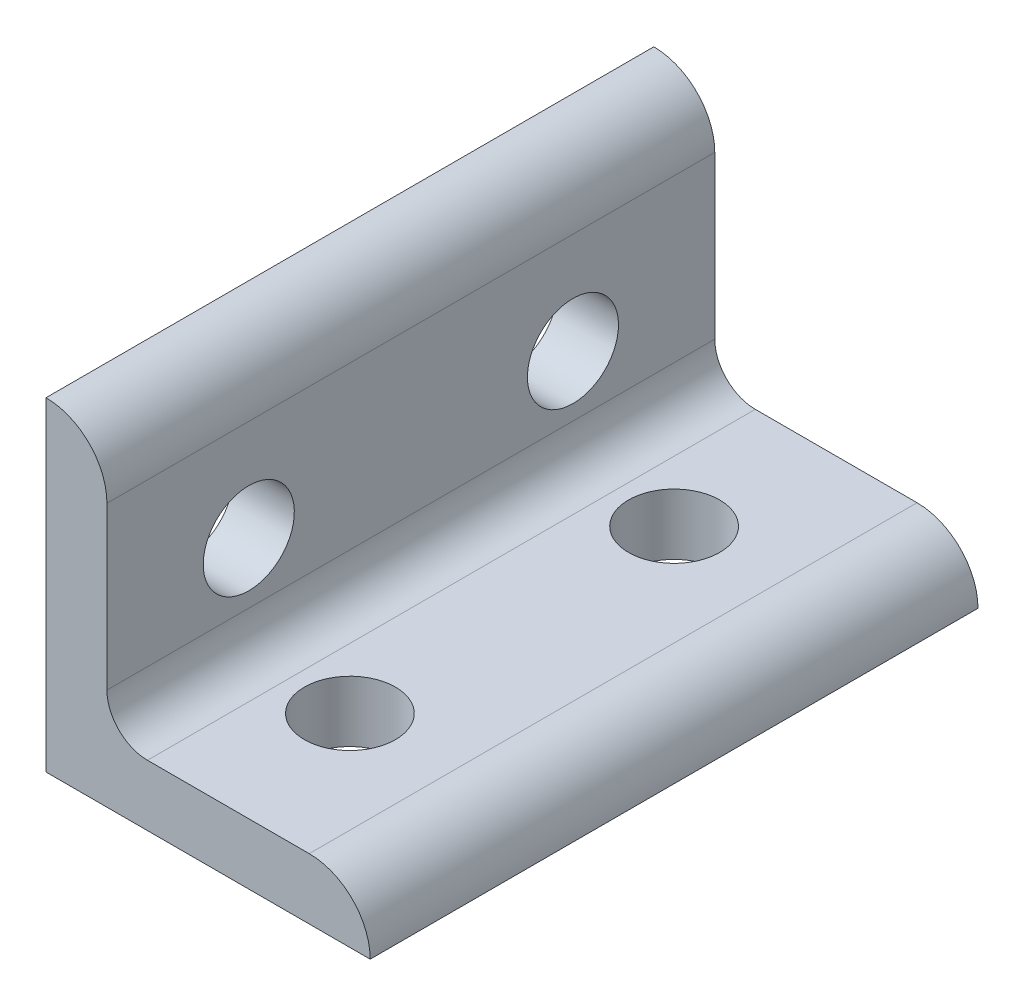
ISO-10303-21;
HEADER;
FILE_DESCRIPTION(('STEP AP214'),'2;1');
FILE_NAME('part.step','',(''),(''),'','','');
FILE_SCHEMA(('AUTOMOTIVE_DESIGN { 1 0 10303 214 1 1 1 1 }'));
ENDSEC;
DATA;
#1=APPLICATION_CONTEXT('core data for automotive mechanical design processes');
#2=APPLICATION_PROTOCOL_DEFINITION('international standard','automotive_design',2000,#1);
#3=PRODUCT_CONTEXT('',#1,'mechanical');
#4=PRODUCT('Part','Part','',(#3));
#5=PRODUCT_RELATED_PRODUCT_CATEGORY('part','',(#4));
#6=PRODUCT_DEFINITION_FORMATION('','',#4);
#7=PRODUCT_DEFINITION_CONTEXT('part definition',#1,'design');
#8=PRODUCT_DEFINITION('design','',#6,#7);
#9=PRODUCT_DEFINITION_SHAPE('','',#8);
#10=(LENGTH_UNIT() NAMED_UNIT(*) SI_UNIT(.MILLI.,.METRE.));
#11=(NAMED_UNIT(*) PLANE_ANGLE_UNIT() SI_UNIT($,.RADIAN.));
#12=(NAMED_UNIT(*) SI_UNIT($,.STERADIAN.) SOLID_ANGLE_UNIT());
#13=UNCERTAINTY_MEASURE_WITH_UNIT(LENGTH_MEASURE(1.E-05),#10,'distance_accuracy_value','');
#14=(GEOMETRIC_REPRESENTATION_CONTEXT(3) GLOBAL_UNCERTAINTY_ASSIGNED_CONTEXT((#13)) GLOBAL_UNIT_ASSIGNED_CONTEXT((#10,
#11,#12)) REPRESENTATION_CONTEXT('',''));
#15=CARTESIAN_POINT('',(0.,0.,0.));
#16=DIRECTION('',(0.,0.,1.));
#17=DIRECTION('',(1.,0.,0.));
#18=AXIS2_PLACEMENT_3D('',#15,#16,#17);
#19=CARTESIAN_POINT('',(4.7752,20.6248,23.8125));
#20=DIRECTION('',(-1.,0.,0.));
#21=DIRECTION('',(0.,-1.,0.));
#22=AXIS2_PLACEMENT_3D('',#19,#20,#21);
#23=PLANE('',#22);
#24=CARTESIAN_POINT('',(4.7752,12.7,12.7));
#25=DIRECTION('',(-1.,0.,0.));
#26=DIRECTION('',(0.,-1.,0.));
#27=AXIS2_PLACEMENT_3D('',#24,#25,#26);
#28=CIRCLE('',#27,3.5687);
#29=CARTESIAN_POINT('',(4.7752,9.1313,12.7));
#30=VERTEX_POINT('',#29);
#31=EDGE_CURVE('E199',#30,#30,#28,.F.);
#32=ORIENTED_EDGE('',*,*,#31,.F.);
#33=EDGE_LOOP('',(#32));
#34=FACE_BOUND('',#33,.T.);
#35=DIRECTION('',(0.,1.,0.));
#36=VECTOR('',#35,1.);
#37=CARTESIAN_POINT('',(4.7752,20.6248,-23.8125));
#38=LINE('',#37,#36);
#39=CARTESIAN_POINT('',(4.7752,7.9502,-23.8125));
#40=VERTEX_POINT('',#39);
#41=CARTESIAN_POINT('',(4.7752,20.6248,-23.8125));
#42=VERTEX_POINT('',#41);
#43=EDGE_CURVE('E120',#40,#42,#38,.T.);
#44=ORIENTED_EDGE('',*,*,#43,.T.);
#45=DIRECTION('',(0.,0.,-1.));
#46=VECTOR('',#45,1.);
#47=CARTESIAN_POINT('',(4.7752,20.6248,23.8125));
#48=LINE('',#47,#46);
#49=CARTESIAN_POINT('',(4.7752,20.6248,23.8125));
#50=VERTEX_POINT('',#49);
#51=EDGE_CURVE('E117',#50,#42,#48,.T.);
#52=ORIENTED_EDGE('',*,*,#51,.F.);
#53=DIRECTION('',(0.,1.,0.));
#54=VECTOR('',#53,1.);
#55=CARTESIAN_POINT('',(4.7752,20.6248,23.8125));
#56=LINE('',#55,#54);
#57=CARTESIAN_POINT('',(4.7752,7.9502,23.8125));
#58=VERTEX_POINT('',#57);
#59=EDGE_CURVE('E106',#58,#50,#56,.T.);
#60=ORIENTED_EDGE('',*,*,#59,.F.);
#61=DIRECTION('',(0.,0.,-1.));
#62=VECTOR('',#61,1.);
#63=CARTESIAN_POINT('',(4.7752,7.9502,23.8125));
#64=LINE('',#63,#62);
#65=EDGE_CURVE('E121',#58,#40,#64,.T.);
#66=ORIENTED_EDGE('',*,*,#65,.T.);
#67=EDGE_LOOP('',(#44,#52,#60,#66));
#68=FACE_BOUND('',#67,.T.);
#69=CARTESIAN_POINT('',(4.7752,12.7,-12.7));
#70=DIRECTION('',(-1.,0.,0.));
#71=DIRECTION('',(0.,-1.,0.));
#72=AXIS2_PLACEMENT_3D('',#69,#70,#71);
#73=CIRCLE('',#72,3.5687);
#74=CARTESIAN_POINT('',(4.7752,9.1313,-12.7));
#75=VERTEX_POINT('',#74);
#76=EDGE_CURVE('E192',#75,#75,#73,.F.);
#77=ORIENTED_EDGE('',*,*,#76,.F.);
#78=EDGE_LOOP('',(#77));
#79=FACE_BOUND('',#78,.T.);
#80=ADVANCED_FACE('F37',(#34,#68,#79),#23,.F.);
#81=CARTESIAN_POINT('',(0.,0.,23.8125));
#82=DIRECTION('',(1.,0.,0.));
#83=DIRECTION('',(0.,0.,-1.));
#84=AXIS2_PLACEMENT_3D('',#81,#82,#83);
#85=PLANE('',#84);
#86=CARTESIAN_POINT('',(0.,12.7,12.7));
#87=DIRECTION('',(1.,0.,0.));
#88=DIRECTION('',(0.,0.,-1.));
#89=AXIS2_PLACEMENT_3D('',#86,#87,#88);
#90=CIRCLE('',#89,3.5687);
#91=CARTESIAN_POINT('',(0.,12.7,9.1313));
#92=VERTEX_POINT('',#91);
#93=EDGE_CURVE('E195',#92,#92,#90,.T.);
#94=ORIENTED_EDGE('',*,*,#93,.T.);
#95=EDGE_LOOP('',(#94));
#96=FACE_BOUND('',#95,.T.);
#97=DIRECTION('',(0.,-1.,0.));
#98=VECTOR('',#97,1.);
#99=CARTESIAN_POINT('',(0.,0.,-23.8125));
#100=LINE('',#99,#98);
#101=CARTESIAN_POINT('',(0.,25.4,-23.8125));
#102=VERTEX_POINT('',#101);
#103=CARTESIAN_POINT('',(0.,0.,-23.8125));
#104=VERTEX_POINT('',#103);
#105=EDGE_CURVE('E88',#102,#104,#100,.T.);
#106=ORIENTED_EDGE('',*,*,#105,.T.);
#107=DIRECTION('',(0.,0.,-1.));
#108=VECTOR('',#107,1.);
#109=CARTESIAN_POINT('',(0.,0.,23.8125));
#110=LINE('',#109,#108);
#111=CARTESIAN_POINT('',(0.,0.,23.8125));
#112=VERTEX_POINT('',#111);
#113=EDGE_CURVE('E126',#112,#104,#110,.T.);
#114=ORIENTED_EDGE('',*,*,#113,.F.);
#115=DIRECTION('',(0.,-1.,0.));
#116=VECTOR('',#115,1.);
#117=CARTESIAN_POINT('',(0.,0.,23.8125));
#118=LINE('',#117,#116);
#119=CARTESIAN_POINT('',(0.,25.4,23.8125));
#120=VERTEX_POINT('',#119);
#121=EDGE_CURVE('E56',#120,#112,#118,.T.);
#122=ORIENTED_EDGE('',*,*,#121,.F.);
#123=DIRECTION('',(0.,0.,-1.));
#124=VECTOR('',#123,1.);
#125=CARTESIAN_POINT('',(0.,25.4,23.8125));
#126=LINE('',#125,#124);
#127=EDGE_CURVE('E122',#120,#102,#126,.T.);
#128=ORIENTED_EDGE('',*,*,#127,.T.);
#129=EDGE_LOOP('',(#106,#114,#122,#128));
#130=FACE_BOUND('',#129,.T.);
#131=CARTESIAN_POINT('',(0.,12.7,-12.7));
#132=DIRECTION('',(1.,0.,0.));
#133=DIRECTION('',(0.,0.,-1.));
#134=AXIS2_PLACEMENT_3D('',#131,#132,#133);
#135=CIRCLE('',#134,3.5687);
#136=CARTESIAN_POINT('',(0.,12.7,-16.2687));
#137=VERTEX_POINT('',#136);
#138=EDGE_CURVE('E190',#137,#137,#135,.T.);
#139=ORIENTED_EDGE('',*,*,#138,.T.);
#140=EDGE_LOOP('',(#139));
#141=FACE_BOUND('',#140,.T.);
#142=ADVANCED_FACE('F183',(#96,#130,#141),#85,.F.);
#143=CARTESIAN_POINT('',(25.4,0.,23.8125));
#144=DIRECTION('',(0.,1.,0.));
#145=DIRECTION('',(-1.,0.,0.));
#146=AXIS2_PLACEMENT_3D('',#143,#144,#145);
#147=PLANE('',#146);
#148=CARTESIAN_POINT('',(12.7,0.,12.7));
#149=DIRECTION('',(0.,1.,0.));
#150=DIRECTION('',(0.,0.,1.));
#151=AXIS2_PLACEMENT_3D('',#148,#149,#150);
#152=CIRCLE('',#151,3.56869999999999);
#153=CARTESIAN_POINT('',(12.7,0.,9.13130000000001));
#154=VERTEX_POINT('',#153);
#155=EDGE_CURVE('E152',#154,#154,#152,.T.);
#156=ORIENTED_EDGE('',*,*,#155,.T.);
#157=EDGE_LOOP('',(#156));
#158=FACE_BOUND('',#157,.T.);
#159=DIRECTION('',(1.,0.,0.));
#160=VECTOR('',#159,1.);
#161=CARTESIAN_POINT('',(25.4,0.,-23.8125));
#162=LINE('',#161,#160);
#163=CARTESIAN_POINT('',(25.4,0.,-23.8125));
#164=VERTEX_POINT('',#163);
#165=EDGE_CURVE('E130',#104,#164,#162,.T.);
#166=ORIENTED_EDGE('',*,*,#165,.T.);
#167=DIRECTION('',(0.,0.,-1.));
#168=VECTOR('',#167,1.);
#169=CARTESIAN_POINT('',(25.4,0.,23.8125));
#170=LINE('',#169,#168);
#171=CARTESIAN_POINT('',(25.4,0.,23.8125));
#172=VERTEX_POINT('',#171);
#173=EDGE_CURVE('E11',#172,#164,#170,.T.);
#174=ORIENTED_EDGE('',*,*,#173,.F.);
#175=DIRECTION('',(1.,0.,0.));
#176=VECTOR('',#175,1.);
#177=CARTESIAN_POINT('',(25.4,0.,23.8125));
#178=LINE('',#177,#176);
#179=EDGE_CURVE('E143',#112,#172,#178,.T.);
#180=ORIENTED_EDGE('',*,*,#179,.F.);
#181=ORIENTED_EDGE('',*,*,#113,.T.);
#182=EDGE_LOOP('',(#166,#174,#180,#181));
#183=FACE_BOUND('',#182,.T.);
#184=CARTESIAN_POINT('',(12.7,0.,-12.7));
#185=DIRECTION('',(0.,1.,0.));
#186=DIRECTION('',(0.,0.,1.));
#187=AXIS2_PLACEMENT_3D('',#184,#185,#186);
#188=CIRCLE('',#187,3.5687);
#189=CARTESIAN_POINT('',(12.7,0.,-16.2687));
#190=VERTEX_POINT('',#189);
#191=EDGE_CURVE('E160',#190,#190,#188,.T.);
#192=ORIENTED_EDGE('',*,*,#191,.T.);
#193=EDGE_LOOP('',(#192));
#194=FACE_BOUND('',#193,.T.);
#195=ADVANCED_FACE('F39',(#158,#183,#194),#147,.F.);
#196=CARTESIAN_POINT('',(7.9502,4.7752,23.8125));
#197=DIRECTION('',(0.,-1.,0.));
#198=DIRECTION('',(0.,0.,-1.));
#199=AXIS2_PLACEMENT_3D('',#196,#197,#198);
#200=PLANE('',#199);
#201=CARTESIAN_POINT('',(12.7,4.7752,12.7));
#202=DIRECTION('',(0.,-1.,0.));
#203=DIRECTION('',(0.,0.,-1.));
#204=AXIS2_PLACEMENT_3D('',#201,#202,#203);
#205=CIRCLE('',#204,3.56869999999999);
#206=CARTESIAN_POINT('',(12.7,4.7752,9.13130000000001));
#207=VERTEX_POINT('',#206);
#208=EDGE_CURVE('E134',#207,#207,#205,.F.);
#209=ORIENTED_EDGE('',*,*,#208,.F.);
#210=EDGE_LOOP('',(#209));
#211=FACE_BOUND('',#210,.T.);
#212=DIRECTION('',(-1.,0.,0.));
#213=VECTOR('',#212,1.);
#214=CARTESIAN_POINT('',(7.9502,4.7752,-23.8125));
#215=LINE('',#214,#213);
#216=CARTESIAN_POINT('',(20.6248,4.7752,-23.8125));
#217=VERTEX_POINT('',#216);
#218=CARTESIAN_POINT('',(7.9502,4.7752,-23.8125));
#219=VERTEX_POINT('',#218);
#220=EDGE_CURVE('E136',#217,#219,#215,.T.);
#221=ORIENTED_EDGE('',*,*,#220,.T.);
#222=DIRECTION('',(0.,0.,-1.));
#223=VECTOR('',#222,1.);
#224=CARTESIAN_POINT('',(7.9502,4.7752,23.8125));
#225=LINE('',#224,#223);
#226=CARTESIAN_POINT('',(7.9502,4.7752,23.8125));
#227=VERTEX_POINT('',#226);
#228=EDGE_CURVE('E147',#227,#219,#225,.T.);
#229=ORIENTED_EDGE('',*,*,#228,.F.);
#230=DIRECTION('',(-1.,0.,0.));
#231=VECTOR('',#230,1.);
#232=CARTESIAN_POINT('',(7.9502,4.7752,23.8125));
#233=LINE('',#232,#231);
#234=CARTESIAN_POINT('',(20.6248,4.7752,23.8125));
#235=VERTEX_POINT('',#234);
#236=EDGE_CURVE('E166',#235,#227,#233,.T.);
#237=ORIENTED_EDGE('',*,*,#236,.F.);
#238=DIRECTION('',(0.,0.,-1.));
#239=VECTOR('',#238,1.);
#240=CARTESIAN_POINT('',(20.6248,4.7752,23.8125));
#241=LINE('',#240,#239);
#242=EDGE_CURVE('E47',#235,#217,#241,.T.);
#243=ORIENTED_EDGE('',*,*,#242,.T.);
#244=EDGE_LOOP('',(#221,#229,#237,#243));
#245=FACE_BOUND('',#244,.T.);
#246=CARTESIAN_POINT('',(12.7,4.7752,-12.7));
#247=DIRECTION('',(0.,-1.,0.));
#248=DIRECTION('',(0.,0.,-1.));
#249=AXIS2_PLACEMENT_3D('',#246,#247,#248);
#250=CIRCLE('',#249,3.5687);
#251=CARTESIAN_POINT('',(12.7,4.7752,-16.2687));
#252=VERTEX_POINT('',#251);
#253=EDGE_CURVE('E41',#252,#252,#250,.F.);
#254=ORIENTED_EDGE('',*,*,#253,.F.);
#255=EDGE_LOOP('',(#254));
#256=FACE_BOUND('',#255,.T.);
#257=ADVANCED_FACE('F170',(#211,#245,#256),#200,.F.);
#258=CARTESIAN_POINT('',(20.6248,0.,23.8125));
#259=DIRECTION('',(0.,0.,-1.));
#260=DIRECTION('',(-1.,0.,0.));
#261=AXIS2_PLACEMENT_3D('',#258,#259,#260);
#262=CYLINDRICAL_SURFACE('',#261,4.7752);
#263=CARTESIAN_POINT('',(20.6248,0.,-23.8125));
#264=DIRECTION('',(0.,0.,1.));
#265=DIRECTION('',(1.,0.,0.));
#266=AXIS2_PLACEMENT_3D('',#263,#264,#265);
#267=CIRCLE('',#266,4.7752);
#268=EDGE_CURVE('E133',#164,#217,#267,.T.);
#269=ORIENTED_EDGE('',*,*,#268,.T.);
#270=ORIENTED_EDGE('',*,*,#242,.F.);
#271=CARTESIAN_POINT('',(20.6248,0.,23.8125));
#272=DIRECTION('',(0.,0.,1.));
#273=DIRECTION('',(1.,0.,0.));
#274=AXIS2_PLACEMENT_3D('',#271,#272,#273);
#275=CIRCLE('',#274,4.7752);
#276=EDGE_CURVE('E96',#172,#235,#275,.T.);
#277=ORIENTED_EDGE('',*,*,#276,.F.);
#278=ORIENTED_EDGE('',*,*,#173,.T.);
#279=EDGE_LOOP('',(#269,#270,#277,#278));
#280=FACE_BOUND('',#279,.T.);
#281=ADVANCED_FACE('F214',(#280),#262,.T.);
#282=CARTESIAN_POINT('',(7.9502,7.9502,23.8125));
#283=DIRECTION('',(0.,0.,-1.));
#284=DIRECTION('',(-1.,0.,0.));
#285=AXIS2_PLACEMENT_3D('',#282,#283,#284);
#286=CYLINDRICAL_SURFACE('',#285,3.175);
#287=CARTESIAN_POINT('',(7.9502,7.9502,-23.8125));
#288=DIRECTION('',(0.,0.,-1.));
#289=DIRECTION('',(1.,0.,0.));
#290=AXIS2_PLACEMENT_3D('',#287,#288,#289);
#291=CIRCLE('',#290,3.175);
#292=EDGE_CURVE('E138',#219,#40,#291,.T.);
#293=ORIENTED_EDGE('',*,*,#292,.T.);
#294=ORIENTED_EDGE('',*,*,#65,.F.);
#295=CARTESIAN_POINT('',(7.9502,7.9502,23.8125));
#296=DIRECTION('',(0.,0.,-1.));
#297=DIRECTION('',(1.,0.,0.));
#298=AXIS2_PLACEMENT_3D('',#295,#296,#297);
#299=CIRCLE('',#298,3.175);
#300=EDGE_CURVE('E112',#227,#58,#299,.T.);
#301=ORIENTED_EDGE('',*,*,#300,.F.);
#302=ORIENTED_EDGE('',*,*,#228,.T.);
#303=EDGE_LOOP('',(#293,#294,#301,#302));
#304=FACE_BOUND('',#303,.T.);
#305=ADVANCED_FACE('F175',(#304),#286,.F.);
#306=CARTESIAN_POINT('',(0.,20.6248,23.8125));
#307=DIRECTION('',(0.,0.,-1.));
#308=DIRECTION('',(-1.,0.,0.));
#309=AXIS2_PLACEMENT_3D('',#306,#307,#308);
#310=CYLINDRICAL_SURFACE('',#309,4.7752);
#311=CARTESIAN_POINT('',(0.,20.6248,-23.8125));
#312=DIRECTION('',(0.,0.,1.));
#313=DIRECTION('',(1.,0.,0.));
#314=AXIS2_PLACEMENT_3D('',#311,#312,#313);
#315=CIRCLE('',#314,4.7752);
#316=EDGE_CURVE('E82',#42,#102,#315,.T.);
#317=ORIENTED_EDGE('',*,*,#316,.T.);
#318=ORIENTED_EDGE('',*,*,#127,.F.);
#319=CARTESIAN_POINT('',(0.,20.6248,23.8125));
#320=DIRECTION('',(0.,0.,1.));
#321=DIRECTION('',(1.,0.,0.));
#322=AXIS2_PLACEMENT_3D('',#319,#320,#321);
#323=CIRCLE('',#322,4.7752);
#324=EDGE_CURVE('E110',#50,#120,#323,.T.);
#325=ORIENTED_EDGE('',*,*,#324,.F.);
#326=ORIENTED_EDGE('',*,*,#51,.T.);
#327=EDGE_LOOP('',(#317,#318,#325,#326));
#328=FACE_BOUND('',#327,.T.);
#329=ADVANCED_FACE('F124',(#328),#310,.T.);
#330=CARTESIAN_POINT('',(0.,20.6248,23.8125));
#331=DIRECTION('',(0.,0.,1.));
#332=DIRECTION('',(1.,0.,0.));
#333=AXIS2_PLACEMENT_3D('',#330,#331,#332);
#334=PLANE('',#333);
#335=ORIENTED_EDGE('',*,*,#179,.T.);
#336=ORIENTED_EDGE('',*,*,#276,.T.);
#337=ORIENTED_EDGE('',*,*,#236,.T.);
#338=ORIENTED_EDGE('',*,*,#300,.T.);
#339=ORIENTED_EDGE('',*,*,#59,.T.);
#340=ORIENTED_EDGE('',*,*,#324,.T.);
#341=ORIENTED_EDGE('',*,*,#121,.T.);
#342=EDGE_LOOP('',(#335,#336,#337,#338,#339,#340,#341));
#343=FACE_BOUND('',#342,.T.);
#344=ADVANCED_FACE('F108',(#343),#334,.T.);
#345=CARTESIAN_POINT('',(0.,20.6248,-23.8125));
#346=DIRECTION('',(0.,0.,1.));
#347=DIRECTION('',(1.,0.,0.));
#348=AXIS2_PLACEMENT_3D('',#345,#346,#347);
#349=PLANE('',#348);
#350=ORIENTED_EDGE('',*,*,#165,.F.);
#351=ORIENTED_EDGE('',*,*,#105,.F.);
#352=ORIENTED_EDGE('',*,*,#316,.F.);
#353=ORIENTED_EDGE('',*,*,#43,.F.);
#354=ORIENTED_EDGE('',*,*,#292,.F.);
#355=ORIENTED_EDGE('',*,*,#220,.F.);
#356=ORIENTED_EDGE('',*,*,#268,.F.);
#357=EDGE_LOOP('',(#350,#351,#352,#353,#354,#355,#356));
#358=FACE_BOUND('',#357,.T.);
#359=ADVANCED_FACE('F178',(#358),#349,.F.);
#360=CARTESIAN_POINT('',(12.7,25.4,12.7));
#361=DIRECTION('',(0.,-1.,0.));
#362=DIRECTION('',(0.,0.,-1.));
#363=AXIS2_PLACEMENT_3D('',#360,#361,#362);
#364=CYLINDRICAL_SURFACE('',#363,3.56869999999999);
#365=CARTESIAN_POINT('',(12.7,0.,9.13130000000001));
#366=CARTESIAN_POINT('',(12.7,0.0497416666666665,9.13130000000001));
#367=CARTESIAN_POINT('',(12.7,0.0994833333333329,9.13130000000001));
#368=CARTESIAN_POINT('',(12.7,0.198966666666666,9.13130000000001));
#369=CARTESIAN_POINT('',(12.7,0.248708333333332,9.13130000000001));
#370=CARTESIAN_POINT('',(12.7,0.348191666666666,9.13130000000001));
#371=CARTESIAN_POINT('',(12.7,0.397933333333334,9.13130000000001));
#372=CARTESIAN_POINT('',(12.7,0.497416666666668,9.13130000000001));
#373=CARTESIAN_POINT('',(12.7,0.547158333333334,9.13130000000001));
#374=CARTESIAN_POINT('',(12.7,0.646641666666667,9.13130000000001));
#375=CARTESIAN_POINT('',(12.7,0.696383333333334,9.13130000000001));
#376=CARTESIAN_POINT('',(12.7,0.795866666666667,9.13130000000001));
#377=CARTESIAN_POINT('',(12.7,0.845608333333333,9.13130000000001));
#378=CARTESIAN_POINT('',(12.7,0.945091666666666,9.13130000000001));
#379=CARTESIAN_POINT('',(12.7,0.994833333333333,9.13130000000001));
#380=CARTESIAN_POINT('',(12.7,1.09431666666667,9.13130000000001));
#381=CARTESIAN_POINT('',(12.7,1.14405833333333,9.13130000000001));
#382=CARTESIAN_POINT('',(12.7,1.24354166666667,9.13130000000001));
#383=CARTESIAN_POINT('',(12.7,1.29328333333333,9.13130000000001));
#384=CARTESIAN_POINT('',(12.7,1.39276666666667,9.13130000000001));
#385=CARTESIAN_POINT('',(12.7,1.44250833333333,9.13130000000001));
#386=CARTESIAN_POINT('',(12.7,1.54199166666667,9.13130000000001));
#387=CARTESIAN_POINT('',(12.7,1.59173333333333,9.13130000000001));
#388=CARTESIAN_POINT('',(12.7,1.69121666666667,9.13130000000001));
#389=CARTESIAN_POINT('',(12.7,1.74095833333333,9.13130000000001));
#390=CARTESIAN_POINT('',(12.7,1.84044166666667,9.13130000000001));
#391=CARTESIAN_POINT('',(12.7,1.89018333333333,9.13130000000001));
#392=CARTESIAN_POINT('',(12.7,1.98966666666667,9.13130000000001));
#393=CARTESIAN_POINT('',(12.7,2.03940833333333,9.13130000000001));
#394=CARTESIAN_POINT('',(12.7,2.13889166666667,9.13130000000001));
#395=CARTESIAN_POINT('',(12.7,2.18863333333333,9.13130000000001));
#396=CARTESIAN_POINT('',(12.7,2.28811666666667,9.13130000000001));
#397=CARTESIAN_POINT('',(12.7,2.33785833333333,9.13130000000001));
#398=CARTESIAN_POINT('',(12.7,2.43734166666667,9.13130000000001));
#399=CARTESIAN_POINT('',(12.7,2.48708333333333,9.13130000000001));
#400=CARTESIAN_POINT('',(12.7,2.58656666666667,9.13130000000001));
#401=CARTESIAN_POINT('',(12.7,2.63630833333333,9.13130000000001));
#402=CARTESIAN_POINT('',(12.7,2.73579166666667,9.13130000000001));
#403=CARTESIAN_POINT('',(12.7,2.78553333333333,9.13130000000001));
#404=CARTESIAN_POINT('',(12.7,2.88501666666667,9.13130000000001));
#405=CARTESIAN_POINT('',(12.7,2.93475833333333,9.13130000000001));
#406=CARTESIAN_POINT('',(12.7,3.03424166666667,9.13130000000001));
#407=CARTESIAN_POINT('',(12.7,3.08398333333333,9.13130000000001));
#408=CARTESIAN_POINT('',(12.7,3.18346666666667,9.13130000000001));
#409=CARTESIAN_POINT('',(12.7,3.23320833333333,9.13130000000001));
#410=CARTESIAN_POINT('',(12.7,3.33269166666667,9.13130000000001));
#411=CARTESIAN_POINT('',(12.7,3.38243333333333,9.13130000000001));
#412=CARTESIAN_POINT('',(12.7,3.48191666666667,9.13130000000001));
#413=CARTESIAN_POINT('',(12.7,3.53165833333333,9.13130000000001));
#414=CARTESIAN_POINT('',(12.7,3.63114166666667,9.13130000000001));
#415=CARTESIAN_POINT('',(12.7,3.68088333333333,9.13130000000001));
#416=CARTESIAN_POINT('',(12.7,3.78036666666667,9.13130000000001));
#417=CARTESIAN_POINT('',(12.7,3.83010833333333,9.13130000000001));
#418=CARTESIAN_POINT('',(12.7,3.92959166666667,9.13130000000001));
#419=CARTESIAN_POINT('',(12.7,3.97933333333333,9.13130000000001));
#420=CARTESIAN_POINT('',(12.7,4.07881666666667,9.13130000000001));
#421=CARTESIAN_POINT('',(12.7,4.12855833333333,9.13130000000001));
#422=CARTESIAN_POINT('',(12.7,4.22804166666667,9.13130000000001));
#423=CARTESIAN_POINT('',(12.7,4.27778333333333,9.13130000000001));
#424=CARTESIAN_POINT('',(12.7,4.37726666666667,9.13130000000001));
#425=CARTESIAN_POINT('',(12.7,4.42700833333333,9.13130000000001));
#426=CARTESIAN_POINT('',(12.7,4.52649166666667,9.13130000000001));
#427=CARTESIAN_POINT('',(12.7,4.57623333333333,9.13130000000001));
#428=CARTESIAN_POINT('',(12.7,4.67571666666667,9.13130000000001));
#429=CARTESIAN_POINT('',(12.7,4.72545833333333,9.13130000000001));
#430=CARTESIAN_POINT('',(12.7,4.7752,9.13130000000001));
#431=B_SPLINE_CURVE_WITH_KNOTS('',3,(#365,#366,#367,#368,#369,#370,#371,#372,#373,#374,#375,
#376,#377,#378,#379,#380,#381,#382,#383,#384,#385,#386,#387,#388,#389,#390,#391,#392,#393,#394,
#395,#396,#397,#398,#399,#400,#401,#402,#403,#404,#405,#406,#407,#408,#409,#410,#411,#412,#413,
#414,#415,#416,#417,#418,#419,#420,#421,#422,#423,#424,#425,#426,#427,#428,#429,#430),
.UNSPECIFIED.,.F.,.F.,(4,2,2,2,2,2,2,2,2,2,2,2,2,2,2,2,2,2,2,2,2,2,2,2,2,2,2,2,2,2,2,2,4),(0.,
0.149224999999999,0.298449999999999,0.447675000000002,0.596900000000001,0.746125,0.89535,
1.044575,1.1938,1.343025,1.49225,1.641475,1.7907,1.939925,2.08915,2.238375,2.3876,2.536825,
2.68605,2.835275,2.9845,3.133725,3.28295,3.432175,3.5814,3.730625,3.87985,4.029075,4.1783,
4.327525,4.47675,4.625975,4.7752),.UNSPECIFIED.);
#432=EDGE_CURVE('BSEAM210',#154,#207,#431,.T.);
#433=ORIENTED_EDGE('',*,*,#155,.F.);
#434=ORIENTED_EDGE('',*,*,#208,.T.);
#435=ORIENTED_EDGE('',*,*,#432,.T.);
#436=ORIENTED_EDGE('',*,*,#432,.F.);
#437=EDGE_LOOP('',(#433,#435,#434,#436));
#438=FACE_BOUND('',#437,.T.);
#439=ADVANCED_FACE('F210',(#438),#364,.F.);
#440=CARTESIAN_POINT('',(12.7,25.4,-12.7));
#441=DIRECTION('',(0.,-1.,0.));
#442=DIRECTION('',(0.,0.,-1.));
#443=AXIS2_PLACEMENT_3D('',#440,#441,#442);
#444=CYLINDRICAL_SURFACE('',#443,3.5687);
#445=CARTESIAN_POINT('',(12.7,0.,-16.2687));
#446=CARTESIAN_POINT('',(12.7,0.0497416666666665,-16.2687));
#447=CARTESIAN_POINT('',(12.7,0.0994833333333329,-16.2687));
#448=CARTESIAN_POINT('',(12.7,0.198966666666666,-16.2687));
#449=CARTESIAN_POINT('',(12.7,0.248708333333332,-16.2687));
#450=CARTESIAN_POINT('',(12.7,0.348191666666666,-16.2687));
#451=CARTESIAN_POINT('',(12.7,0.397933333333334,-16.2687));
#452=CARTESIAN_POINT('',(12.7,0.497416666666668,-16.2687));
#453=CARTESIAN_POINT('',(12.7,0.547158333333334,-16.2687));
#454=CARTESIAN_POINT('',(12.7,0.646641666666667,-16.2687));
#455=CARTESIAN_POINT('',(12.7,0.696383333333334,-16.2687));
#456=CARTESIAN_POINT('',(12.7,0.795866666666667,-16.2687));
#457=CARTESIAN_POINT('',(12.7,0.845608333333333,-16.2687));
#458=CARTESIAN_POINT('',(12.7,0.945091666666666,-16.2687));
#459=CARTESIAN_POINT('',(12.7,0.994833333333333,-16.2687));
#460=CARTESIAN_POINT('',(12.7,1.09431666666667,-16.2687));
#461=CARTESIAN_POINT('',(12.7,1.14405833333333,-16.2687));
#462=CARTESIAN_POINT('',(12.7,1.24354166666667,-16.2687));
#463=CARTESIAN_POINT('',(12.7,1.29328333333333,-16.2687));
#464=CARTESIAN_POINT('',(12.7,1.39276666666667,-16.2687));
#465=CARTESIAN_POINT('',(12.7,1.44250833333333,-16.2687));
#466=CARTESIAN_POINT('',(12.7,1.54199166666667,-16.2687));
#467=CARTESIAN_POINT('',(12.7,1.59173333333333,-16.2687));
#468=CARTESIAN_POINT('',(12.7,1.69121666666667,-16.2687));
#469=CARTESIAN_POINT('',(12.7,1.74095833333333,-16.2687));
#470=CARTESIAN_POINT('',(12.7,1.84044166666667,-16.2687));
#471=CARTESIAN_POINT('',(12.7,1.89018333333333,-16.2687));
#472=CARTESIAN_POINT('',(12.7,1.98966666666667,-16.2687));
#473=CARTESIAN_POINT('',(12.7,2.03940833333333,-16.2687));
#474=CARTESIAN_POINT('',(12.7,2.13889166666667,-16.2687));
#475=CARTESIAN_POINT('',(12.7,2.18863333333333,-16.2687));
#476=CARTESIAN_POINT('',(12.7,2.28811666666667,-16.2687));
#477=CARTESIAN_POINT('',(12.7,2.33785833333333,-16.2687));
#478=CARTESIAN_POINT('',(12.7,2.43734166666667,-16.2687));
#479=CARTESIAN_POINT('',(12.7,2.48708333333333,-16.2687));
#480=CARTESIAN_POINT('',(12.7,2.58656666666667,-16.2687));
#481=CARTESIAN_POINT('',(12.7,2.63630833333333,-16.2687));
#482=CARTESIAN_POINT('',(12.7,2.73579166666667,-16.2687));
#483=CARTESIAN_POINT('',(12.7,2.78553333333333,-16.2687));
#484=CARTESIAN_POINT('',(12.7,2.88501666666667,-16.2687));
#485=CARTESIAN_POINT('',(12.7,2.93475833333333,-16.2687));
#486=CARTESIAN_POINT('',(12.7,3.03424166666667,-16.2687));
#487=CARTESIAN_POINT('',(12.7,3.08398333333333,-16.2687));
#488=CARTESIAN_POINT('',(12.7,3.18346666666667,-16.2687));
#489=CARTESIAN_POINT('',(12.7,3.23320833333333,-16.2687));
#490=CARTESIAN_POINT('',(12.7,3.33269166666667,-16.2687));
#491=CARTESIAN_POINT('',(12.7,3.38243333333333,-16.2687));
#492=CARTESIAN_POINT('',(12.7,3.48191666666667,-16.2687));
#493=CARTESIAN_POINT('',(12.7,3.53165833333333,-16.2687));
#494=CARTESIAN_POINT('',(12.7,3.63114166666667,-16.2687));
#495=CARTESIAN_POINT('',(12.7,3.68088333333333,-16.2687));
#496=CARTESIAN_POINT('',(12.7,3.78036666666667,-16.2687));
#497=CARTESIAN_POINT('',(12.7,3.83010833333333,-16.2687));
#498=CARTESIAN_POINT('',(12.7,3.92959166666667,-16.2687));
#499=CARTESIAN_POINT('',(12.7,3.97933333333333,-16.2687));
#500=CARTESIAN_POINT('',(12.7,4.07881666666667,-16.2687));
#501=CARTESIAN_POINT('',(12.7,4.12855833333333,-16.2687));
#502=CARTESIAN_POINT('',(12.7,4.22804166666667,-16.2687));
#503=CARTESIAN_POINT('',(12.7,4.27778333333333,-16.2687));
#504=CARTESIAN_POINT('',(12.7,4.37726666666667,-16.2687));
#505=CARTESIAN_POINT('',(12.7,4.42700833333333,-16.2687));
#506=CARTESIAN_POINT('',(12.7,4.52649166666667,-16.2687));
#507=CARTESIAN_POINT('',(12.7,4.57623333333333,-16.2687));
#508=CARTESIAN_POINT('',(12.7,4.67571666666667,-16.2687));
#509=CARTESIAN_POINT('',(12.7,4.72545833333333,-16.2687));
#510=CARTESIAN_POINT('',(12.7,4.7752,-16.2687));
#511=B_SPLINE_CURVE_WITH_KNOTS('',3,(#445,#446,#447,#448,#449,#450,#451,#452,#453,#454,#455,
#456,#457,#458,#459,#460,#461,#462,#463,#464,#465,#466,#467,#468,#469,#470,#471,#472,#473,#474,
#475,#476,#477,#478,#479,#480,#481,#482,#483,#484,#485,#486,#487,#488,#489,#490,#491,#492,#493,
#494,#495,#496,#497,#498,#499,#500,#501,#502,#503,#504,#505,#506,#507,#508,#509,#510),
.UNSPECIFIED.,.F.,.F.,(4,2,2,2,2,2,2,2,2,2,2,2,2,2,2,2,2,2,2,2,2,2,2,2,2,2,2,2,2,2,2,2,4),(0.,
0.149224999999999,0.298449999999999,0.447675000000002,0.596900000000001,0.746125,0.89535,
1.044575,1.1938,1.343025,1.49225,1.641475,1.7907,1.939925,2.08915,2.238375,2.3876,2.536825,
2.68605,2.835275,2.9845,3.133725,3.28295,3.432175,3.5814,3.730625,3.87985,4.029075,4.1783,
4.327525,4.47675,4.625975,4.7752),.UNSPECIFIED.);
#512=EDGE_CURVE('BSEAM206',#190,#252,#511,.T.);
#513=ORIENTED_EDGE('',*,*,#191,.F.);
#514=ORIENTED_EDGE('',*,*,#253,.T.);
#515=ORIENTED_EDGE('',*,*,#512,.T.);
#516=ORIENTED_EDGE('',*,*,#512,.F.);
#517=EDGE_LOOP('',(#513,#515,#514,#516));
#518=FACE_BOUND('',#517,.T.);
#519=ADVANCED_FACE('F206',(#518),#444,.F.);
#520=CARTESIAN_POINT('',(25.4,12.7,12.7));
#521=DIRECTION('',(-1.,0.,0.));
#522=DIRECTION('',(0.,0.,1.));
#523=AXIS2_PLACEMENT_3D('',#520,#521,#522);
#524=CYLINDRICAL_SURFACE('',#523,3.5687);
#525=ORIENTED_EDGE('',*,*,#93,.F.);
#526=EDGE_LOOP('',(#525));
#527=FACE_BOUND('',#526,.T.);
#528=ORIENTED_EDGE('',*,*,#31,.T.);
#529=EDGE_LOOP('',(#528));
#530=FACE_BOUND('',#529,.T.);
#531=ADVANCED_FACE('F209',(#527,#530),#524,.F.);
#532=CARTESIAN_POINT('',(25.4,12.7,-12.7));
#533=DIRECTION('',(-1.,0.,0.));
#534=DIRECTION('',(0.,0.,1.));
#535=AXIS2_PLACEMENT_3D('',#532,#533,#534);
#536=CYLINDRICAL_SURFACE('',#535,3.5687);
#537=ORIENTED_EDGE('',*,*,#138,.F.);
#538=EDGE_LOOP('',(#537));
#539=FACE_BOUND('',#538,.T.);
#540=ORIENTED_EDGE('',*,*,#76,.T.);
#541=EDGE_LOOP('',(#540));
#542=FACE_BOUND('',#541,.T.);
#543=ADVANCED_FACE('F246',(#539,#542),#536,.F.);
#544=CLOSED_SHELL('',(#80,#142,#195,#257,#281,#305,#329,#344,#359,#439,#519,#531,#543));
#545=MANIFOLD_SOLID_BREP('B2',#544);
#546=ADVANCED_BREP_SHAPE_REPRESENTATION('',(#18,#545),#14);
#547=SHAPE_DEFINITION_REPRESENTATION(#9,#546);
ENDSEC;
END-ISO-10303-21;
